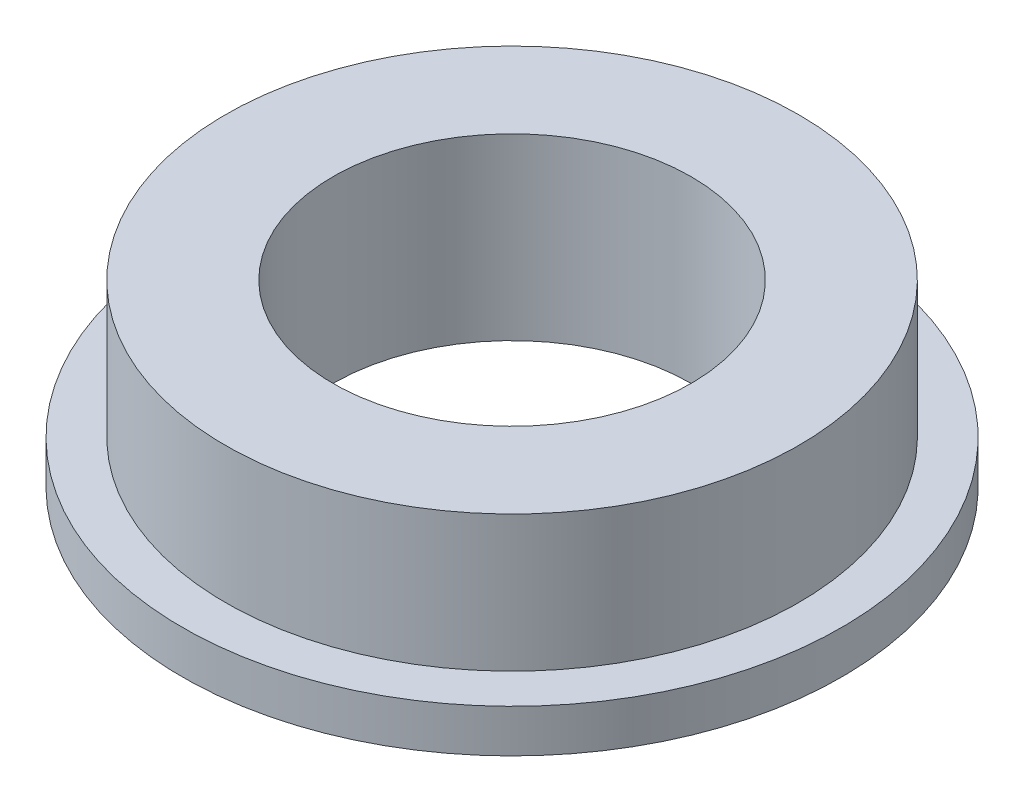
ISO-10303-21;
HEADER;
FILE_DESCRIPTION(('STEP AP214'),'2;1');
FILE_NAME('part.step','',(''),(''),'','','');
FILE_SCHEMA(('AUTOMOTIVE_DESIGN { 1 0 10303 214 1 1 1 1 }'));
ENDSEC;
DATA;
#1=APPLICATION_CONTEXT('core data for automotive mechanical design processes');
#2=APPLICATION_PROTOCOL_DEFINITION('international standard','automotive_design',2000,#1);
#3=PRODUCT_CONTEXT('',#1,'mechanical');
#4=PRODUCT('Part','Part','',(#3));
#5=PRODUCT_RELATED_PRODUCT_CATEGORY('part','',(#4));
#6=PRODUCT_DEFINITION_FORMATION('','',#4);
#7=PRODUCT_DEFINITION_CONTEXT('part definition',#1,'design');
#8=PRODUCT_DEFINITION('design','',#6,#7);
#9=PRODUCT_DEFINITION_SHAPE('','',#8);
#10=(LENGTH_UNIT() NAMED_UNIT(*) SI_UNIT(.MILLI.,.METRE.));
#11=(NAMED_UNIT(*) PLANE_ANGLE_UNIT() SI_UNIT($,.RADIAN.));
#12=(NAMED_UNIT(*) SI_UNIT($,.STERADIAN.) SOLID_ANGLE_UNIT());
#13=UNCERTAINTY_MEASURE_WITH_UNIT(LENGTH_MEASURE(1.E-05),#10,'distance_accuracy_value','');
#14=(GEOMETRIC_REPRESENTATION_CONTEXT(3) GLOBAL_UNCERTAINTY_ASSIGNED_CONTEXT((#13)) GLOBAL_UNIT_ASSIGNED_CONTEXT((#10,
#11,#12)) REPRESENTATION_CONTEXT('',''));
#15=CARTESIAN_POINT('',(0.,0.,0.));
#16=DIRECTION('',(0.,0.,1.));
#17=DIRECTION('',(1.,0.,0.));
#18=AXIS2_PLACEMENT_3D('',#15,#16,#17);
#19=CARTESIAN_POINT('',(4.6,0.,0.));
#20=DIRECTION('',(0.,-1.,0.));
#21=DIRECTION('',(0.,0.,-1.));
#22=AXIS2_PLACEMENT_3D('',#19,#20,#21);
#23=PLANE('',#22);
#24=CARTESIAN_POINT('',(0.,0.,0.));
#25=DIRECTION('',(0.,-1.,0.));
#26=DIRECTION('',(0.,0.,-1.));
#27=AXIS2_PLACEMENT_3D('',#24,#25,#26);
#28=CIRCLE('',#27,4.6);
#29=CARTESIAN_POINT('',(0.,0.,-4.6));
#30=VERTEX_POINT('',#29);
#31=EDGE_CURVE('E55',#30,#30,#28,.T.);
#32=ORIENTED_EDGE('',*,*,#31,.T.);
#33=EDGE_LOOP('',(#32));
#34=FACE_BOUND('',#33,.T.);
#35=CARTESIAN_POINT('',(0.,0.,0.));
#36=DIRECTION('',(0.,-1.,0.));
#37=DIRECTION('',(0.,0.,-1.));
#38=AXIS2_PLACEMENT_3D('',#35,#36,#37);
#39=CIRCLE('',#38,2.5);
#40=CARTESIAN_POINT('',(0.,0.,-2.5));
#41=VERTEX_POINT('',#40);
#42=EDGE_CURVE('E10',#41,#41,#39,.T.);
#43=ORIENTED_EDGE('',*,*,#42,.F.);
#44=EDGE_LOOP('',(#43));
#45=FACE_BOUND('',#44,.T.);
#46=ADVANCED_FACE('F33',(#34,#45),#23,.T.);
#47=CARTESIAN_POINT('',(0.,0.,0.));
#48=DIRECTION('',(0.,-1.,0.));
#49=DIRECTION('',(0.,0.,-1.));
#50=AXIS2_PLACEMENT_3D('',#47,#48,#49);
#51=CYLINDRICAL_SURFACE('',#50,2.5);
#52=ORIENTED_EDGE('',*,*,#42,.T.);
#53=EDGE_LOOP('',(#52));
#54=FACE_BOUND('',#53,.T.);
#55=CARTESIAN_POINT('',(0.,2.5,0.));
#56=DIRECTION('',(0.,-1.,0.));
#57=DIRECTION('',(0.,0.,-1.));
#58=AXIS2_PLACEMENT_3D('',#55,#56,#57);
#59=CIRCLE('',#58,2.5);
#60=CARTESIAN_POINT('',(0.,2.5,-2.5));
#61=VERTEX_POINT('',#60);
#62=EDGE_CURVE('E39',#61,#61,#59,.T.);
#63=ORIENTED_EDGE('',*,*,#62,.F.);
#64=EDGE_LOOP('',(#63));
#65=FACE_BOUND('',#64,.T.);
#66=ADVANCED_FACE('F73',(#54,#65),#51,.F.);
#67=CARTESIAN_POINT('',(2.5,2.5,0.));
#68=DIRECTION('',(0.,1.,0.));
#69=DIRECTION('',(0.,0.,1.));
#70=AXIS2_PLACEMENT_3D('',#67,#68,#69);
#71=PLANE('',#70);
#72=ORIENTED_EDGE('',*,*,#62,.T.);
#73=EDGE_LOOP('',(#72));
#74=FACE_BOUND('',#73,.T.);
#75=CARTESIAN_POINT('',(0.,2.5,0.));
#76=DIRECTION('',(0.,-1.,0.));
#77=DIRECTION('',(0.,0.,-1.));
#78=AXIS2_PLACEMENT_3D('',#75,#76,#77);
#79=CIRCLE('',#78,4.);
#80=CARTESIAN_POINT('',(0.,2.5,-4.));
#81=VERTEX_POINT('',#80);
#82=EDGE_CURVE('E43',#81,#81,#79,.T.);
#83=ORIENTED_EDGE('',*,*,#82,.F.);
#84=EDGE_LOOP('',(#83));
#85=FACE_BOUND('',#84,.T.);
#86=ADVANCED_FACE('F77',(#74,#85),#71,.T.);
#87=CARTESIAN_POINT('',(0.,0.,0.));
#88=DIRECTION('',(0.,-1.,0.));
#89=DIRECTION('',(0.,0.,-1.));
#90=AXIS2_PLACEMENT_3D('',#87,#88,#89);
#91=CYLINDRICAL_SURFACE('',#90,4.);
#92=ORIENTED_EDGE('',*,*,#82,.T.);
#93=EDGE_LOOP('',(#92));
#94=FACE_BOUND('',#93,.T.);
#95=CARTESIAN_POINT('',(0.,0.6,0.));
#96=DIRECTION('',(0.,-1.,0.));
#97=DIRECTION('',(0.,0.,-1.));
#98=AXIS2_PLACEMENT_3D('',#95,#96,#97);
#99=CIRCLE('',#98,4.);
#100=CARTESIAN_POINT('',(0.,0.6,-4.));
#101=VERTEX_POINT('',#100);
#102=EDGE_CURVE('E47',#101,#101,#99,.T.);
#103=ORIENTED_EDGE('',*,*,#102,.F.);
#104=EDGE_LOOP('',(#103));
#105=FACE_BOUND('',#104,.T.);
#106=ADVANCED_FACE('F69',(#94,#105),#91,.T.);
#107=CARTESIAN_POINT('',(4.,0.6,0.));
#108=DIRECTION('',(0.,1.,0.));
#109=DIRECTION('',(0.,0.,1.));
#110=AXIS2_PLACEMENT_3D('',#107,#108,#109);
#111=PLANE('',#110);
#112=ORIENTED_EDGE('',*,*,#102,.T.);
#113=EDGE_LOOP('',(#112));
#114=FACE_BOUND('',#113,.T.);
#115=CARTESIAN_POINT('',(0.,0.6,0.));
#116=DIRECTION('',(0.,-1.,0.));
#117=DIRECTION('',(0.,0.,-1.));
#118=AXIS2_PLACEMENT_3D('',#115,#116,#117);
#119=CIRCLE('',#118,4.6);
#120=CARTESIAN_POINT('',(0.,0.6,-4.6));
#121=VERTEX_POINT('',#120);
#122=EDGE_CURVE('E52',#121,#121,#119,.T.);
#123=ORIENTED_EDGE('',*,*,#122,.F.);
#124=EDGE_LOOP('',(#123));
#125=FACE_BOUND('',#124,.T.);
#126=ADVANCED_FACE('F63',(#114,#125),#111,.T.);
#127=CARTESIAN_POINT('',(0.,0.,0.));
#128=DIRECTION('',(0.,-1.,0.));
#129=DIRECTION('',(0.,0.,-1.));
#130=AXIS2_PLACEMENT_3D('',#127,#128,#129);
#131=CYLINDRICAL_SURFACE('',#130,4.6);
#132=ORIENTED_EDGE('',*,*,#122,.T.);
#133=EDGE_LOOP('',(#132));
#134=FACE_BOUND('',#133,.T.);
#135=ORIENTED_EDGE('',*,*,#31,.F.);
#136=EDGE_LOOP('',(#135));
#137=FACE_BOUND('',#136,.T.);
#138=ADVANCED_FACE('F61',(#134,#137),#131,.T.);
#139=CLOSED_SHELL('',(#46,#66,#86,#106,#126,#138));
#140=MANIFOLD_SOLID_BREP('B2',#139);
#141=ADVANCED_BREP_SHAPE_REPRESENTATION('',(#18,#140),#14);
#142=SHAPE_DEFINITION_REPRESENTATION(#9,#141);
ENDSEC;
END-ISO-10303-21;
